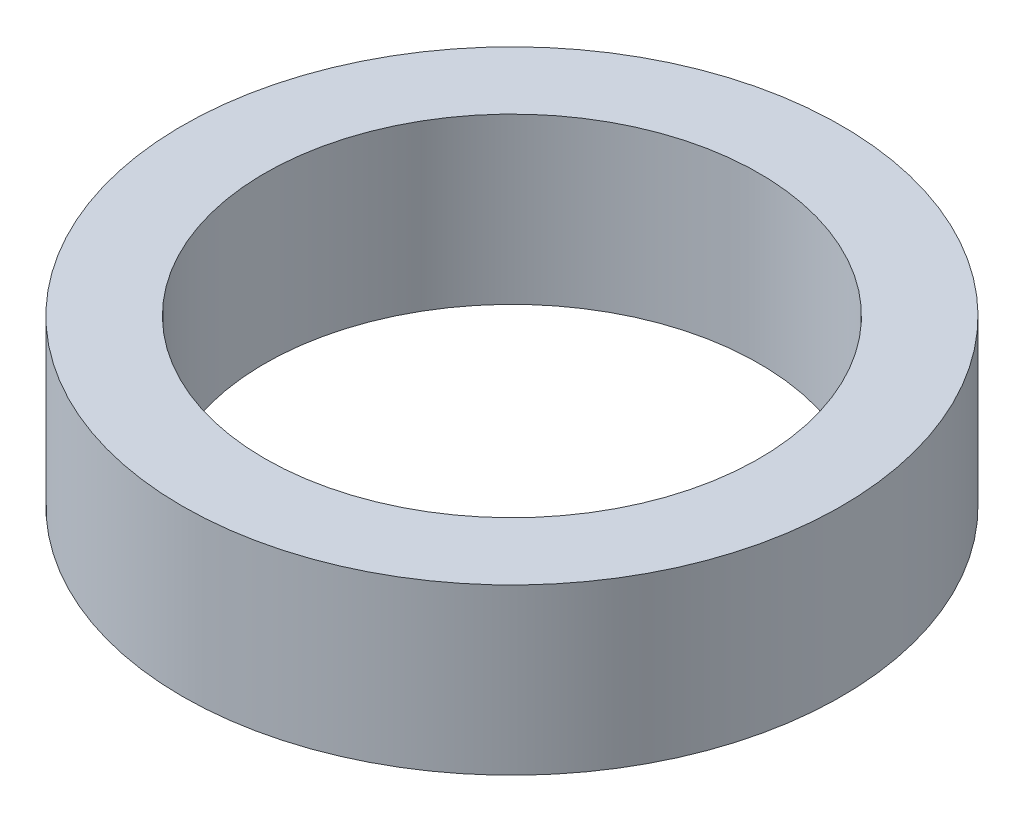
ISO-10303-21;
HEADER;
FILE_DESCRIPTION(('STEP AP214'),'2;1');
FILE_NAME('part.step','',(''),(''),'','','');
FILE_SCHEMA(('AUTOMOTIVE_DESIGN { 1 0 10303 214 1 1 1 1 }'));
ENDSEC;
DATA;
#1=APPLICATION_CONTEXT('core data for automotive mechanical design processes');
#2=APPLICATION_PROTOCOL_DEFINITION('international standard','automotive_design',2000,#1);
#3=PRODUCT_CONTEXT('',#1,'mechanical');
#4=PRODUCT('Part','Part','',(#3));
#5=PRODUCT_RELATED_PRODUCT_CATEGORY('part','',(#4));
#6=PRODUCT_DEFINITION_FORMATION('','',#4);
#7=PRODUCT_DEFINITION_CONTEXT('part definition',#1,'design');
#8=PRODUCT_DEFINITION('design','',#6,#7);
#9=PRODUCT_DEFINITION_SHAPE('','',#8);
#10=(LENGTH_UNIT() NAMED_UNIT(*) SI_UNIT(.MILLI.,.METRE.));
#11=(NAMED_UNIT(*) PLANE_ANGLE_UNIT() SI_UNIT($,.RADIAN.));
#12=(NAMED_UNIT(*) SI_UNIT($,.STERADIAN.) SOLID_ANGLE_UNIT());
#13=UNCERTAINTY_MEASURE_WITH_UNIT(LENGTH_MEASURE(1.E-05),#10,'distance_accuracy_value','');
#14=(GEOMETRIC_REPRESENTATION_CONTEXT(3) GLOBAL_UNCERTAINTY_ASSIGNED_CONTEXT((#13)) GLOBAL_UNIT_ASSIGNED_CONTEXT((#10,
#11,#12)) REPRESENTATION_CONTEXT('',''));
#15=CARTESIAN_POINT('',(0.,0.,0.));
#16=DIRECTION('',(0.,0.,1.));
#17=DIRECTION('',(1.,0.,0.));
#18=AXIS2_PLACEMENT_3D('',#15,#16,#17);
#19=CARTESIAN_POINT('',(0.,5.,0.));
#20=DIRECTION('',(0.,1.,0.));
#21=DIRECTION('',(0.,0.,1.));
#22=AXIS2_PLACEMENT_3D('',#19,#20,#21);
#23=PLANE('',#22);
#24=CARTESIAN_POINT('',(0.,5.,0.));
#25=DIRECTION('',(0.,1.,0.));
#26=DIRECTION('',(0.,0.,1.));
#27=AXIS2_PLACEMENT_3D('',#24,#25,#26);
#28=CIRCLE('',#27,20.);
#29=CARTESIAN_POINT('',(0.,5.,20.));
#30=VERTEX_POINT('',#29);
#31=EDGE_CURVE('E10',#30,#30,#28,.T.);
#32=ORIENTED_EDGE('',*,*,#31,.T.);
#33=EDGE_LOOP('',(#32));
#34=FACE_BOUND('',#33,.T.);
#35=CARTESIAN_POINT('',(0.,5.,0.));
#36=DIRECTION('',(0.,1.,0.));
#37=DIRECTION('',(0.,0.,1.));
#38=AXIS2_PLACEMENT_3D('',#35,#36,#37);
#39=CIRCLE('',#38,15.);
#40=CARTESIAN_POINT('',(0.,5.,15.));
#41=VERTEX_POINT('',#40);
#42=EDGE_CURVE('E44',#41,#41,#39,.T.);
#43=ORIENTED_EDGE('',*,*,#42,.F.);
#44=EDGE_LOOP('',(#43));
#45=FACE_BOUND('',#44,.T.);
#46=ADVANCED_FACE('F33',(#34,#45),#23,.T.);
#47=CARTESIAN_POINT('',(0.,-5.,0.));
#48=DIRECTION('',(0.,1.,0.));
#49=DIRECTION('',(0.,0.,1.));
#50=AXIS2_PLACEMENT_3D('',#47,#48,#49);
#51=PLANE('',#50);
#52=CARTESIAN_POINT('',(0.,-5.,0.));
#53=DIRECTION('',(0.,1.,0.));
#54=DIRECTION('',(0.,0.,1.));
#55=AXIS2_PLACEMENT_3D('',#52,#53,#54);
#56=CIRCLE('',#55,20.);
#57=CARTESIAN_POINT('',(0.,-5.,20.));
#58=VERTEX_POINT('',#57);
#59=EDGE_CURVE('E37',#58,#58,#56,.T.);
#60=ORIENTED_EDGE('',*,*,#59,.F.);
#61=EDGE_LOOP('',(#60));
#62=FACE_BOUND('',#61,.T.);
#63=CARTESIAN_POINT('',(0.,-5.,0.));
#64=DIRECTION('',(0.,1.,0.));
#65=DIRECTION('',(0.,0.,1.));
#66=AXIS2_PLACEMENT_3D('',#63,#64,#65);
#67=CIRCLE('',#66,15.);
#68=CARTESIAN_POINT('',(0.,-5.,15.));
#69=VERTEX_POINT('',#68);
#70=EDGE_CURVE('E46',#69,#69,#67,.T.);
#71=ORIENTED_EDGE('',*,*,#70,.T.);
#72=EDGE_LOOP('',(#71));
#73=FACE_BOUND('',#72,.T.);
#74=ADVANCED_FACE('F56',(#62,#73),#51,.F.);
#75=CARTESIAN_POINT('',(0.,5.,0.));
#76=DIRECTION('',(0.,-1.,0.));
#77=DIRECTION('',(0.,0.,-1.));
#78=AXIS2_PLACEMENT_3D('',#75,#76,#77);
#79=CYLINDRICAL_SURFACE('',#78,20.);
#80=ORIENTED_EDGE('',*,*,#31,.F.);
#81=EDGE_LOOP('',(#80));
#82=FACE_BOUND('',#81,.T.);
#83=ORIENTED_EDGE('',*,*,#59,.T.);
#84=EDGE_LOOP('',(#83));
#85=FACE_BOUND('',#84,.T.);
#86=ADVANCED_FACE('F35',(#82,#85),#79,.T.);
#87=CARTESIAN_POINT('',(0.,5.,0.));
#88=DIRECTION('',(0.,-1.,0.));
#89=DIRECTION('',(0.,0.,-1.));
#90=AXIS2_PLACEMENT_3D('',#87,#88,#89);
#91=CYLINDRICAL_SURFACE('',#90,15.);
#92=ORIENTED_EDGE('',*,*,#42,.T.);
#93=EDGE_LOOP('',(#92));
#94=FACE_BOUND('',#93,.T.);
#95=ORIENTED_EDGE('',*,*,#70,.F.);
#96=EDGE_LOOP('',(#95));
#97=FACE_BOUND('',#96,.T.);
#98=ADVANCED_FACE('F52',(#94,#97),#91,.F.);
#99=CLOSED_SHELL('',(#46,#74,#86,#98));
#100=MANIFOLD_SOLID_BREP('B2',#99);
#101=ADVANCED_BREP_SHAPE_REPRESENTATION('',(#18,#100),#14);
#102=SHAPE_DEFINITION_REPRESENTATION(#9,#101);
ENDSEC;
END-ISO-10303-21;
